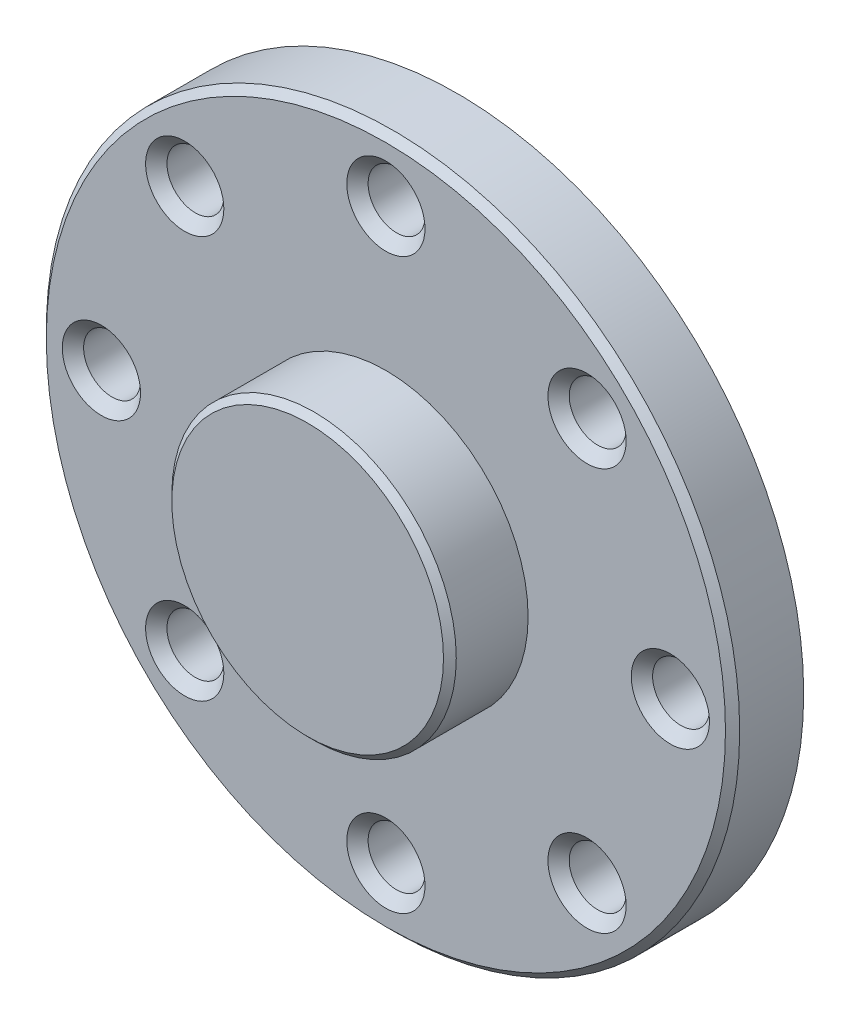
ISO-10303-21;
HEADER;
FILE_DESCRIPTION(('STEP AP214'),'2;1');
FILE_NAME('part.step','',(''),(''),'','','');
FILE_SCHEMA(('AUTOMOTIVE_DESIGN { 1 0 10303 214 1 1 1 1 }'));
ENDSEC;
DATA;
#1=APPLICATION_CONTEXT('core data for automotive mechanical design processes');
#2=APPLICATION_PROTOCOL_DEFINITION('international standard','automotive_design',2000,#1);
#3=PRODUCT_CONTEXT('',#1,'mechanical');
#4=PRODUCT('Part','Part','',(#3));
#5=PRODUCT_RELATED_PRODUCT_CATEGORY('part','',(#4));
#6=PRODUCT_DEFINITION_FORMATION('','',#4);
#7=PRODUCT_DEFINITION_CONTEXT('part definition',#1,'design');
#8=PRODUCT_DEFINITION('design','',#6,#7);
#9=PRODUCT_DEFINITION_SHAPE('','',#8);
#10=(LENGTH_UNIT() NAMED_UNIT(*) SI_UNIT(.MILLI.,.METRE.));
#11=(NAMED_UNIT(*) PLANE_ANGLE_UNIT() SI_UNIT($,.RADIAN.));
#12=(NAMED_UNIT(*) SI_UNIT($,.STERADIAN.) SOLID_ANGLE_UNIT());
#13=UNCERTAINTY_MEASURE_WITH_UNIT(LENGTH_MEASURE(1.E-05),#10,'distance_accuracy_value','');
#14=(GEOMETRIC_REPRESENTATION_CONTEXT(3) GLOBAL_UNCERTAINTY_ASSIGNED_CONTEXT((#13)) GLOBAL_UNIT_ASSIGNED_CONTEXT((#10,
#11,#12)) REPRESENTATION_CONTEXT('',''));
#15=CARTESIAN_POINT('',(0.,0.,0.));
#16=DIRECTION('',(0.,0.,1.));
#17=DIRECTION('',(1.,0.,0.));
#18=AXIS2_PLACEMENT_3D('',#15,#16,#17);
#19=CARTESIAN_POINT('',(0.,0.,2.));
#20=DIRECTION('',(0.,0.,-1.));
#21=DIRECTION('',(-1.,0.,0.));
#22=AXIS2_PLACEMENT_3D('',#19,#20,#21);
#23=CYLINDRICAL_SURFACE('',#22,9.75);
#24=CARTESIAN_POINT('',(0.,0.,1.79999999999999));
#25=DIRECTION('',(0.,0.,1.));
#26=DIRECTION('',(1.,0.,0.));
#27=AXIS2_PLACEMENT_3D('',#24,#25,#26);
#28=CIRCLE('',#27,9.75);
#29=CARTESIAN_POINT('',(9.75,0.,1.79999999999999));
#30=VERTEX_POINT('',#29);
#31=EDGE_CURVE('E96',#30,#30,#28,.F.);
#32=ORIENTED_EDGE('',*,*,#31,.T.);
#33=EDGE_LOOP('',(#32));
#34=FACE_BOUND('',#33,.T.);
#35=CARTESIAN_POINT('',(0.,0.,0.));
#36=DIRECTION('',(0.,0.,1.));
#37=DIRECTION('',(1.,0.,0.));
#38=AXIS2_PLACEMENT_3D('',#35,#36,#37);
#39=CIRCLE('',#38,9.75);
#40=CARTESIAN_POINT('',(9.75,0.,0.));
#41=VERTEX_POINT('',#40);
#42=EDGE_CURVE('E103',#41,#41,#39,.T.);
#43=ORIENTED_EDGE('',*,*,#42,.T.);
#44=EDGE_LOOP('',(#43));
#45=FACE_BOUND('',#44,.T.);
#46=ADVANCED_FACE('F33',(#34,#45),#23,.T.);
#47=CARTESIAN_POINT('',(0.,0.,2.));
#48=DIRECTION('',(0.,0.,1.));
#49=DIRECTION('',(1.,0.,0.));
#50=AXIS2_PLACEMENT_3D('',#47,#48,#49);
#51=PLANE('',#50);
#52=CARTESIAN_POINT('',(-5.65685424949231,5.65685424949245,2.));
#53=DIRECTION('',(0.,0.,1.));
#54=DIRECTION('',(1.,0.,0.));
#55=AXIS2_PLACEMENT_3D('',#52,#53,#54);
#56=CIRCLE('',#55,1.10000000000001);
#57=CARTESIAN_POINT('',(-4.5568542494923,5.65685424949245,2.));
#58=VERTEX_POINT('',#57);
#59=EDGE_CURVE('E10',#58,#58,#56,.F.);
#60=ORIENTED_EDGE('',*,*,#59,.T.);
#61=EDGE_LOOP('',(#60));
#62=FACE_BOUND('',#61,.T.);
#63=CARTESIAN_POINT('',(-8.,0.,2.));
#64=DIRECTION('',(0.,0.,1.));
#65=DIRECTION('',(1.,0.,0.));
#66=AXIS2_PLACEMENT_3D('',#63,#64,#65);
#67=CIRCLE('',#66,1.1);
#68=CARTESIAN_POINT('',(-6.9,0.,2.));
#69=VERTEX_POINT('',#68);
#70=EDGE_CURVE('E45',#69,#69,#67,.F.);
#71=ORIENTED_EDGE('',*,*,#70,.T.);
#72=EDGE_LOOP('',(#71));
#73=FACE_BOUND('',#72,.T.);
#74=CARTESIAN_POINT('',(-5.65685424949243,-5.65685424949233,2.));
#75=DIRECTION('',(0.,0.,1.));
#76=DIRECTION('',(1.,0.,0.));
#77=AXIS2_PLACEMENT_3D('',#74,#75,#76);
#78=CIRCLE('',#77,1.1);
#79=CARTESIAN_POINT('',(-4.55685424949243,-5.65685424949233,2.));
#80=VERTEX_POINT('',#79);
#81=EDGE_CURVE('E54',#80,#80,#78,.F.);
#82=ORIENTED_EDGE('',*,*,#81,.T.);
#83=EDGE_LOOP('',(#82));
#84=FACE_BOUND('',#83,.T.);
#85=CARTESIAN_POINT('',(0.,-8.,2.));
#86=DIRECTION('',(0.,0.,1.));
#87=DIRECTION('',(1.,0.,0.));
#88=AXIS2_PLACEMENT_3D('',#85,#86,#87);
#89=CIRCLE('',#88,1.1);
#90=CARTESIAN_POINT('',(1.1,-8.,2.));
#91=VERTEX_POINT('',#90);
#92=EDGE_CURVE('E60',#91,#91,#89,.F.);
#93=ORIENTED_EDGE('',*,*,#92,.T.);
#94=EDGE_LOOP('',(#93));
#95=FACE_BOUND('',#94,.T.);
#96=CARTESIAN_POINT('',(5.65685424949235,-5.65685424949241,2.));
#97=DIRECTION('',(0.,0.,1.));
#98=DIRECTION('',(1.,0.,0.));
#99=AXIS2_PLACEMENT_3D('',#96,#97,#98);
#100=CIRCLE('',#99,1.10000000000001);
#101=CARTESIAN_POINT('',(6.75685424949236,-5.65685424949241,2.));
#102=VERTEX_POINT('',#101);
#103=EDGE_CURVE('E66',#102,#102,#100,.F.);
#104=ORIENTED_EDGE('',*,*,#103,.T.);
#105=EDGE_LOOP('',(#104));
#106=FACE_BOUND('',#105,.T.);
#107=CARTESIAN_POINT('',(8.,0.,2.));
#108=DIRECTION('',(0.,0.,1.));
#109=DIRECTION('',(1.,0.,0.));
#110=AXIS2_PLACEMENT_3D('',#107,#108,#109);
#111=CIRCLE('',#110,1.1);
#112=CARTESIAN_POINT('',(9.1,0.,2.));
#113=VERTEX_POINT('',#112);
#114=EDGE_CURVE('E72',#113,#113,#111,.F.);
#115=ORIENTED_EDGE('',*,*,#114,.T.);
#116=EDGE_LOOP('',(#115));
#117=FACE_BOUND('',#116,.T.);
#118=CARTESIAN_POINT('',(5.65685424949239,5.65685424949237,2.));
#119=DIRECTION('',(0.,0.,1.));
#120=DIRECTION('',(1.,0.,0.));
#121=AXIS2_PLACEMENT_3D('',#118,#119,#120);
#122=CIRCLE('',#121,1.1);
#123=CARTESIAN_POINT('',(6.75685424949239,5.65685424949237,2.));
#124=VERTEX_POINT('',#123);
#125=EDGE_CURVE('E78',#124,#124,#122,.F.);
#126=ORIENTED_EDGE('',*,*,#125,.T.);
#127=EDGE_LOOP('',(#126));
#128=FACE_BOUND('',#127,.T.);
#129=CARTESIAN_POINT('',(0.,8.,2.));
#130=DIRECTION('',(0.,0.,1.));
#131=DIRECTION('',(1.,0.,0.));
#132=AXIS2_PLACEMENT_3D('',#129,#130,#131);
#133=CIRCLE('',#132,1.1);
#134=CARTESIAN_POINT('',(1.1,8.,2.));
#135=VERTEX_POINT('',#134);
#136=EDGE_CURVE('E84',#135,#135,#133,.F.);
#137=ORIENTED_EDGE('',*,*,#136,.T.);
#138=EDGE_LOOP('',(#137));
#139=FACE_BOUND('',#138,.T.);
#140=CARTESIAN_POINT('',(0.,0.,2.));
#141=DIRECTION('',(0.,0.,1.));
#142=DIRECTION('',(1.,0.,0.));
#143=AXIS2_PLACEMENT_3D('',#140,#141,#142);
#144=CIRCLE('',#143,9.55);
#145=CARTESIAN_POINT('',(9.55,0.,2.));
#146=VERTEX_POINT('',#145);
#147=EDGE_CURVE('E99',#146,#146,#144,.T.);
#148=ORIENTED_EDGE('',*,*,#147,.T.);
#149=EDGE_LOOP('',(#148));
#150=FACE_BOUND('',#149,.T.);
#151=CARTESIAN_POINT('',(0.,0.,2.));
#152=DIRECTION('',(0.,0.,1.));
#153=DIRECTION('',(1.,0.,0.));
#154=AXIS2_PLACEMENT_3D('',#151,#152,#153);
#155=CIRCLE('',#154,4.);
#156=CARTESIAN_POINT('',(4.,0.,2.));
#157=VERTEX_POINT('',#156);
#158=EDGE_CURVE('E102',#157,#157,#155,.T.);
#159=ORIENTED_EDGE('',*,*,#158,.F.);
#160=EDGE_LOOP('',(#159));
#161=FACE_BOUND('',#160,.T.);
#162=ADVANCED_FACE('F152',(#62,#73,#84,#95,#106,#117,#128,#139,#150,#161),#51,.T.);
#163=CARTESIAN_POINT('',(0.,0.,0.));
#164=DIRECTION('',(0.,0.,1.));
#165=DIRECTION('',(1.,0.,0.));
#166=AXIS2_PLACEMENT_3D('',#163,#164,#165);
#167=PLANE('',#166);
#168=CARTESIAN_POINT('',(8.,0.,0.));
#169=DIRECTION('',(0.,0.,1.));
#170=DIRECTION('',(0.,-1.,0.));
#171=AXIS2_PLACEMENT_3D('',#168,#169,#170);
#172=CIRCLE('',#171,0.8);
#173=CARTESIAN_POINT('',(8.,-0.800000000000028,0.));
#174=VERTEX_POINT('',#173);
#175=EDGE_CURVE('E114',#174,#174,#172,.T.);
#176=ORIENTED_EDGE('',*,*,#175,.T.);
#177=EDGE_LOOP('',(#176));
#178=FACE_BOUND('',#177,.T.);
#179=CARTESIAN_POINT('',(5.65685424949235,-5.65685424949241,0.));
#180=DIRECTION('',(0.,0.,1.));
#181=DIRECTION('',(-0.707106781186551,-0.707106781186544,0.));
#182=AXIS2_PLACEMENT_3D('',#179,#180,#181);
#183=CIRCLE('',#182,0.8);
#184=CARTESIAN_POINT('',(5.09116882454311,-6.22253967444165,0.));
#185=VERTEX_POINT('',#184);
#186=EDGE_CURVE('E122',#185,#185,#183,.T.);
#187=ORIENTED_EDGE('',*,*,#186,.T.);
#188=EDGE_LOOP('',(#187));
#189=FACE_BOUND('',#188,.T.);
#190=CARTESIAN_POINT('',(0.,-8.,0.));
#191=DIRECTION('',(0.,0.,1.));
#192=DIRECTION('',(-1.,0.,0.));
#193=AXIS2_PLACEMENT_3D('',#190,#191,#192);
#194=CIRCLE('',#193,0.8);
#195=CARTESIAN_POINT('',(-0.8,-8.,0.));
#196=VERTEX_POINT('',#195);
#197=EDGE_CURVE('E118',#196,#196,#194,.T.);
#198=ORIENTED_EDGE('',*,*,#197,.T.);
#199=EDGE_LOOP('',(#198));
#200=FACE_BOUND('',#199,.T.);
#201=CARTESIAN_POINT('',(-5.65685424949243,-5.65685424949233,0.));
#202=DIRECTION('',(0.,0.,1.));
#203=DIRECTION('',(-0.707106781186541,0.707106781186554,0.));
#204=AXIS2_PLACEMENT_3D('',#201,#202,#203);
#205=CIRCLE('',#204,0.8);
#206=CARTESIAN_POINT('',(-6.22253967444166,-5.09116882454309,0.));
#207=VERTEX_POINT('',#206);
#208=EDGE_CURVE('E115',#207,#207,#205,.T.);
#209=ORIENTED_EDGE('',*,*,#208,.T.);
#210=EDGE_LOOP('',(#209));
#211=FACE_BOUND('',#210,.T.);
#212=CARTESIAN_POINT('',(-8.,0.,0.));
#213=DIRECTION('',(0.,0.,1.));
#214=DIRECTION('',(0.,1.,0.));
#215=AXIS2_PLACEMENT_3D('',#212,#213,#214);
#216=CIRCLE('',#215,0.8);
#217=CARTESIAN_POINT('',(-7.99999999999999,0.800000000000084,0.));
#218=VERTEX_POINT('',#217);
#219=EDGE_CURVE('E119',#218,#218,#216,.T.);
#220=ORIENTED_EDGE('',*,*,#219,.T.);
#221=EDGE_LOOP('',(#220));
#222=FACE_BOUND('',#221,.T.);
#223=CARTESIAN_POINT('',(-5.65685424949231,5.65685424949245,0.));
#224=DIRECTION('',(0.,0.,1.));
#225=DIRECTION('',(0.707106781186556,0.707106781186539,0.));
#226=AXIS2_PLACEMENT_3D('',#223,#224,#225);
#227=CIRCLE('',#226,0.8);
#228=CARTESIAN_POINT('',(-5.09116882454307,6.22253967444168,0.));
#229=VERTEX_POINT('',#228);
#230=EDGE_CURVE('E127',#229,#229,#227,.T.);
#231=ORIENTED_EDGE('',*,*,#230,.T.);
#232=EDGE_LOOP('',(#231));
#233=FACE_BOUND('',#232,.T.);
#234=CARTESIAN_POINT('',(5.65685424949239,5.65685424949237,0.));
#235=DIRECTION('',(0.,0.,1.));
#236=DIRECTION('',(0.707106781186546,-0.707106781186549,0.));
#237=AXIS2_PLACEMENT_3D('',#234,#235,#236);
#238=CIRCLE('',#237,0.8);
#239=CARTESIAN_POINT('',(6.22253967444163,5.09116882454313,0.));
#240=VERTEX_POINT('',#239);
#241=EDGE_CURVE('E111',#240,#240,#238,.T.);
#242=ORIENTED_EDGE('',*,*,#241,.T.);
#243=EDGE_LOOP('',(#242));
#244=FACE_BOUND('',#243,.T.);
#245=CARTESIAN_POINT('',(0.,8.,0.));
#246=DIRECTION('',(0.,0.,1.));
#247=DIRECTION('',(1.,0.,0.));
#248=AXIS2_PLACEMENT_3D('',#245,#246,#247);
#249=CIRCLE('',#248,0.8);
#250=CARTESIAN_POINT('',(0.8,8.,0.));
#251=VERTEX_POINT('',#250);
#252=EDGE_CURVE('E106',#251,#251,#249,.T.);
#253=ORIENTED_EDGE('',*,*,#252,.T.);
#254=EDGE_LOOP('',(#253));
#255=FACE_BOUND('',#254,.T.);
#256=ORIENTED_EDGE('',*,*,#42,.F.);
#257=EDGE_LOOP('',(#256));
#258=FACE_BOUND('',#257,.T.);
#259=ADVANCED_FACE('F133',(#178,#189,#200,#211,#222,#233,#244,#255,#258),#167,.F.);
#260=CARTESIAN_POINT('',(0.,0.,4.2));
#261=DIRECTION('',(0.,0.,-1.));
#262=DIRECTION('',(-1.,0.,0.));
#263=AXIS2_PLACEMENT_3D('',#260,#261,#262);
#264=CYLINDRICAL_SURFACE('',#263,4.);
#265=CARTESIAN_POINT('',(0.,0.,4.02));
#266=DIRECTION('',(0.,0.,1.));
#267=DIRECTION('',(1.,0.,0.));
#268=AXIS2_PLACEMENT_3D('',#265,#266,#267);
#269=CIRCLE('',#268,4.);
#270=CARTESIAN_POINT('',(4.,0.,4.02));
#271=VERTEX_POINT('',#270);
#272=EDGE_CURVE('E90',#271,#271,#269,.F.);
#273=ORIENTED_EDGE('',*,*,#272,.T.);
#274=EDGE_LOOP('',(#273));
#275=FACE_BOUND('',#274,.T.);
#276=ORIENTED_EDGE('',*,*,#158,.T.);
#277=EDGE_LOOP('',(#276));
#278=FACE_BOUND('',#277,.T.);
#279=ADVANCED_FACE('F251',(#275,#278),#264,.T.);
#280=CARTESIAN_POINT('',(0.,0.,4.2));
#281=DIRECTION('',(0.,0.,1.));
#282=DIRECTION('',(1.,0.,0.));
#283=AXIS2_PLACEMENT_3D('',#280,#281,#282);
#284=PLANE('',#283);
#285=CARTESIAN_POINT('',(0.,0.,4.2));
#286=DIRECTION('',(0.,0.,1.));
#287=DIRECTION('',(1.,0.,0.));
#288=AXIS2_PLACEMENT_3D('',#285,#286,#287);
#289=CIRCLE('',#288,3.82);
#290=CARTESIAN_POINT('',(3.82,0.,4.2));
#291=VERTEX_POINT('',#290);
#292=EDGE_CURVE('E93',#291,#291,#289,.T.);
#293=ORIENTED_EDGE('',*,*,#292,.T.);
#294=EDGE_LOOP('',(#293));
#295=FACE_BOUND('',#294,.T.);
#296=ADVANCED_FACE('F170',(#295),#284,.T.);
#297=CARTESIAN_POINT('',(0.,0.,2.));
#298=DIRECTION('',(0.,0.,-1.));
#299=DIRECTION('',(-1.,0.,0.));
#300=AXIS2_PLACEMENT_3D('',#297,#298,#299);
#301=CONICAL_SURFACE('',#300,9.55,0.785398163397444);
#302=ORIENTED_EDGE('',*,*,#31,.F.);
#303=EDGE_LOOP('',(#302));
#304=FACE_BOUND('',#303,.T.);
#305=ORIENTED_EDGE('',*,*,#147,.F.);
#306=EDGE_LOOP('',(#305));
#307=FACE_BOUND('',#306,.T.);
#308=ADVANCED_FACE('F163',(#304,#307),#301,.T.);
#309=CARTESIAN_POINT('',(0.,0.,4.2));
#310=DIRECTION('',(0.,0.,-1.));
#311=DIRECTION('',(-1.,0.,0.));
#312=AXIS2_PLACEMENT_3D('',#309,#310,#311);
#313=CONICAL_SURFACE('',#312,3.82,0.785398163397446);
#314=ORIENTED_EDGE('',*,*,#272,.F.);
#315=EDGE_LOOP('',(#314));
#316=FACE_BOUND('',#315,.T.);
#317=ORIENTED_EDGE('',*,*,#292,.F.);
#318=EDGE_LOOP('',(#317));
#319=FACE_BOUND('',#318,.T.);
#320=ADVANCED_FACE('F169',(#316,#319),#313,.T.);
#321=CARTESIAN_POINT('',(0.,8.,0.));
#322=DIRECTION('',(0.,0.,1.));
#323=DIRECTION('',(1.,0.,0.));
#324=AXIS2_PLACEMENT_3D('',#321,#322,#323);
#325=CYLINDRICAL_SURFACE('',#324,0.8);
#326=CARTESIAN_POINT('',(0.,8.,1.7));
#327=DIRECTION('',(0.,0.,1.));
#328=DIRECTION('',(1.,0.,0.));
#329=AXIS2_PLACEMENT_3D('',#326,#327,#328);
#330=CIRCLE('',#329,0.8);
#331=CARTESIAN_POINT('',(0.8,8.,1.7));
#332=VERTEX_POINT('',#331);
#333=EDGE_CURVE('E87',#332,#332,#330,.T.);
#334=ORIENTED_EDGE('',*,*,#333,.T.);
#335=EDGE_LOOP('',(#334));
#336=FACE_BOUND('',#335,.T.);
#337=ORIENTED_EDGE('',*,*,#252,.F.);
#338=EDGE_LOOP('',(#337));
#339=FACE_BOUND('',#338,.T.);
#340=ADVANCED_FACE('F177',(#336,#339),#325,.F.);
#341=CARTESIAN_POINT('',(0.,8.,1.7));
#342=DIRECTION('',(0.,0.,1.));
#343=DIRECTION('',(1.,0.,0.));
#344=AXIS2_PLACEMENT_3D('',#341,#342,#343);
#345=CONICAL_SURFACE('',#344,0.8,0.785398163397446);
#346=ORIENTED_EDGE('',*,*,#136,.F.);
#347=EDGE_LOOP('',(#346));
#348=FACE_BOUND('',#347,.T.);
#349=ORIENTED_EDGE('',*,*,#333,.F.);
#350=EDGE_LOOP('',(#349));
#351=FACE_BOUND('',#350,.T.);
#352=ADVANCED_FACE('F179',(#348,#351),#345,.F.);
#353=CARTESIAN_POINT('',(5.65685424949239,5.65685424949237,0.));
#354=DIRECTION('',(0.,0.,1.));
#355=DIRECTION('',(1.,0.,0.));
#356=AXIS2_PLACEMENT_3D('',#353,#354,#355);
#357=CYLINDRICAL_SURFACE('',#356,0.8);
#358=CARTESIAN_POINT('',(5.65685424949239,5.65685424949237,1.7));
#359=DIRECTION('',(0.,0.,1.));
#360=DIRECTION('',(1.,0.,0.));
#361=AXIS2_PLACEMENT_3D('',#358,#359,#360);
#362=CIRCLE('',#361,0.8);
#363=CARTESIAN_POINT('',(6.45685424949239,5.65685424949237,1.7));
#364=VERTEX_POINT('',#363);
#365=EDGE_CURVE('E81',#364,#364,#362,.T.);
#366=ORIENTED_EDGE('',*,*,#365,.T.);
#367=EDGE_LOOP('',(#366));
#368=FACE_BOUND('',#367,.T.);
#369=ORIENTED_EDGE('',*,*,#241,.F.);
#370=EDGE_LOOP('',(#369));
#371=FACE_BOUND('',#370,.T.);
#372=ADVANCED_FACE('F149',(#368,#371),#357,.F.);
#373=CARTESIAN_POINT('',(-5.65685424949231,5.65685424949245,0.));
#374=DIRECTION('',(0.,0.,1.));
#375=DIRECTION('',(1.,0.,0.));
#376=AXIS2_PLACEMENT_3D('',#373,#374,#375);
#377=CYLINDRICAL_SURFACE('',#376,0.8);
#378=CARTESIAN_POINT('',(-5.65685424949231,5.65685424949245,1.69999999999999));
#379=DIRECTION('',(0.,0.,1.));
#380=DIRECTION('',(1.,0.,0.));
#381=AXIS2_PLACEMENT_3D('',#378,#379,#380);
#382=CIRCLE('',#381,0.8);
#383=CARTESIAN_POINT('',(-4.85685424949231,5.65685424949245,1.69999999999999));
#384=VERTEX_POINT('',#383);
#385=EDGE_CURVE('E41',#384,#384,#382,.T.);
#386=ORIENTED_EDGE('',*,*,#385,.T.);
#387=EDGE_LOOP('',(#386));
#388=FACE_BOUND('',#387,.T.);
#389=ORIENTED_EDGE('',*,*,#230,.F.);
#390=EDGE_LOOP('',(#389));
#391=FACE_BOUND('',#390,.T.);
#392=ADVANCED_FACE('F139',(#388,#391),#377,.F.);
#393=CARTESIAN_POINT('',(-8.,0.,0.));
#394=DIRECTION('',(0.,0.,1.));
#395=DIRECTION('',(1.,0.,0.));
#396=AXIS2_PLACEMENT_3D('',#393,#394,#395);
#397=CYLINDRICAL_SURFACE('',#396,0.8);
#398=CARTESIAN_POINT('',(-8.,0.,1.7));
#399=DIRECTION('',(0.,0.,1.));
#400=DIRECTION('',(1.,0.,0.));
#401=AXIS2_PLACEMENT_3D('',#398,#399,#400);
#402=CIRCLE('',#401,0.8);
#403=CARTESIAN_POINT('',(-7.2,0.,1.7));
#404=VERTEX_POINT('',#403);
#405=EDGE_CURVE('E49',#404,#404,#402,.T.);
#406=ORIENTED_EDGE('',*,*,#405,.T.);
#407=EDGE_LOOP('',(#406));
#408=FACE_BOUND('',#407,.T.);
#409=ORIENTED_EDGE('',*,*,#219,.F.);
#410=EDGE_LOOP('',(#409));
#411=FACE_BOUND('',#410,.T.);
#412=ADVANCED_FACE('F136',(#408,#411),#397,.F.);
#413=CARTESIAN_POINT('',(-5.65685424949243,-5.65685424949233,0.));
#414=DIRECTION('',(0.,0.,1.));
#415=DIRECTION('',(1.,0.,0.));
#416=AXIS2_PLACEMENT_3D('',#413,#414,#415);
#417=CYLINDRICAL_SURFACE('',#416,0.8);
#418=CARTESIAN_POINT('',(-5.65685424949243,-5.65685424949233,1.7));
#419=DIRECTION('',(0.,0.,1.));
#420=DIRECTION('',(1.,0.,0.));
#421=AXIS2_PLACEMENT_3D('',#418,#419,#420);
#422=CIRCLE('',#421,0.8);
#423=CARTESIAN_POINT('',(-4.85685424949243,-5.65685424949233,1.7));
#424=VERTEX_POINT('',#423);
#425=EDGE_CURVE('E57',#424,#424,#422,.T.);
#426=ORIENTED_EDGE('',*,*,#425,.T.);
#427=EDGE_LOOP('',(#426));
#428=FACE_BOUND('',#427,.T.);
#429=ORIENTED_EDGE('',*,*,#208,.F.);
#430=EDGE_LOOP('',(#429));
#431=FACE_BOUND('',#430,.T.);
#432=ADVANCED_FACE('F138',(#428,#431),#417,.F.);
#433=CARTESIAN_POINT('',(0.,-8.,0.));
#434=DIRECTION('',(0.,0.,1.));
#435=DIRECTION('',(1.,0.,0.));
#436=AXIS2_PLACEMENT_3D('',#433,#434,#435);
#437=CYLINDRICAL_SURFACE('',#436,0.8);
#438=CARTESIAN_POINT('',(0.,-8.,1.7));
#439=DIRECTION('',(0.,0.,1.));
#440=DIRECTION('',(1.,0.,0.));
#441=AXIS2_PLACEMENT_3D('',#438,#439,#440);
#442=CIRCLE('',#441,0.8);
#443=CARTESIAN_POINT('',(0.8,-8.,1.7));
#444=VERTEX_POINT('',#443);
#445=EDGE_CURVE('E63',#444,#444,#442,.T.);
#446=ORIENTED_EDGE('',*,*,#445,.T.);
#447=EDGE_LOOP('',(#446));
#448=FACE_BOUND('',#447,.T.);
#449=ORIENTED_EDGE('',*,*,#197,.F.);
#450=EDGE_LOOP('',(#449));
#451=FACE_BOUND('',#450,.T.);
#452=ADVANCED_FACE('F146',(#448,#451),#437,.F.);
#453=CARTESIAN_POINT('',(5.65685424949235,-5.65685424949241,0.));
#454=DIRECTION('',(0.,0.,1.));
#455=DIRECTION('',(1.,0.,0.));
#456=AXIS2_PLACEMENT_3D('',#453,#454,#455);
#457=CYLINDRICAL_SURFACE('',#456,0.8);
#458=CARTESIAN_POINT('',(5.65685424949235,-5.65685424949241,1.69999999999999));
#459=DIRECTION('',(0.,0.,1.));
#460=DIRECTION('',(1.,0.,0.));
#461=AXIS2_PLACEMENT_3D('',#458,#459,#460);
#462=CIRCLE('',#461,0.8);
#463=CARTESIAN_POINT('',(6.45685424949235,-5.65685424949241,1.69999999999999));
#464=VERTEX_POINT('',#463);
#465=EDGE_CURVE('E69',#464,#464,#462,.T.);
#466=ORIENTED_EDGE('',*,*,#465,.T.);
#467=EDGE_LOOP('',(#466));
#468=FACE_BOUND('',#467,.T.);
#469=ORIENTED_EDGE('',*,*,#186,.F.);
#470=EDGE_LOOP('',(#469));
#471=FACE_BOUND('',#470,.T.);
#472=ADVANCED_FACE('F271',(#468,#471),#457,.F.);
#473=CARTESIAN_POINT('',(8.,0.,0.));
#474=DIRECTION('',(0.,0.,1.));
#475=DIRECTION('',(1.,0.,0.));
#476=AXIS2_PLACEMENT_3D('',#473,#474,#475);
#477=CYLINDRICAL_SURFACE('',#476,0.8);
#478=CARTESIAN_POINT('',(8.,0.,1.7));
#479=DIRECTION('',(0.,0.,1.));
#480=DIRECTION('',(1.,0.,0.));
#481=AXIS2_PLACEMENT_3D('',#478,#479,#480);
#482=CIRCLE('',#481,0.8);
#483=CARTESIAN_POINT('',(8.8,0.,1.7));
#484=VERTEX_POINT('',#483);
#485=EDGE_CURVE('E75',#484,#484,#482,.T.);
#486=ORIENTED_EDGE('',*,*,#485,.T.);
#487=EDGE_LOOP('',(#486));
#488=FACE_BOUND('',#487,.T.);
#489=ORIENTED_EDGE('',*,*,#175,.F.);
#490=EDGE_LOOP('',(#489));
#491=FACE_BOUND('',#490,.T.);
#492=ADVANCED_FACE('F193',(#488,#491),#477,.F.);
#493=CARTESIAN_POINT('',(5.65685424949239,5.65685424949237,1.7));
#494=DIRECTION('',(0.,0.,1.));
#495=DIRECTION('',(1.,0.,0.));
#496=AXIS2_PLACEMENT_3D('',#493,#494,#495);
#497=CONICAL_SURFACE('',#496,0.8,0.785398163397447);
#498=ORIENTED_EDGE('',*,*,#125,.F.);
#499=EDGE_LOOP('',(#498));
#500=FACE_BOUND('',#499,.T.);
#501=ORIENTED_EDGE('',*,*,#365,.F.);
#502=EDGE_LOOP('',(#501));
#503=FACE_BOUND('',#502,.T.);
#504=ADVANCED_FACE('F186',(#500,#503),#497,.F.);
#505=CARTESIAN_POINT('',(8.,0.,1.7));
#506=DIRECTION('',(0.,0.,1.));
#507=DIRECTION('',(1.,0.,0.));
#508=AXIS2_PLACEMENT_3D('',#505,#506,#507);
#509=CONICAL_SURFACE('',#508,0.8,0.785398163397446);
#510=ORIENTED_EDGE('',*,*,#114,.F.);
#511=EDGE_LOOP('',(#510));
#512=FACE_BOUND('',#511,.T.);
#513=ORIENTED_EDGE('',*,*,#485,.F.);
#514=EDGE_LOOP('',(#513));
#515=FACE_BOUND('',#514,.T.);
#516=ADVANCED_FACE('F192',(#512,#515),#509,.F.);
#517=CARTESIAN_POINT('',(5.65685424949235,-5.65685424949241,1.69999999999999));
#518=DIRECTION('',(0.,0.,1.));
#519=DIRECTION('',(1.,0.,0.));
#520=AXIS2_PLACEMENT_3D('',#517,#518,#519);
#521=CONICAL_SURFACE('',#520,0.8,0.785398163397452);
#522=ORIENTED_EDGE('',*,*,#103,.F.);
#523=EDGE_LOOP('',(#522));
#524=FACE_BOUND('',#523,.T.);
#525=ORIENTED_EDGE('',*,*,#465,.F.);
#526=EDGE_LOOP('',(#525));
#527=FACE_BOUND('',#526,.T.);
#528=ADVANCED_FACE('F200',(#524,#527),#521,.F.);
#529=CARTESIAN_POINT('',(0.,-8.,1.7));
#530=DIRECTION('',(0.,0.,1.));
#531=DIRECTION('',(1.,0.,0.));
#532=AXIS2_PLACEMENT_3D('',#529,#530,#531);
#533=CONICAL_SURFACE('',#532,0.8,0.785398163397446);
#534=ORIENTED_EDGE('',*,*,#92,.F.);
#535=EDGE_LOOP('',(#534));
#536=FACE_BOUND('',#535,.T.);
#537=ORIENTED_EDGE('',*,*,#445,.F.);
#538=EDGE_LOOP('',(#537));
#539=FACE_BOUND('',#538,.T.);
#540=ADVANCED_FACE('F207',(#536,#539),#533,.F.);
#541=CARTESIAN_POINT('',(-5.65685424949243,-5.65685424949233,1.7));
#542=DIRECTION('',(0.,0.,1.));
#543=DIRECTION('',(1.,0.,0.));
#544=AXIS2_PLACEMENT_3D('',#541,#542,#543);
#545=CONICAL_SURFACE('',#544,0.8,0.78539816339745);
#546=CARTESIAN_POINT('',(-4.55685424949243,-5.65685424949233,2.));
#547=CARTESIAN_POINT('',(-4.55997924949243,-5.65685424949233,1.996875));
#548=CARTESIAN_POINT('',(-4.56310424949243,-5.65685424949233,1.99375));
#549=CARTESIAN_POINT('',(-4.56935424949243,-5.65685424949233,1.9875));
#550=CARTESIAN_POINT('',(-4.57247924949243,-5.65685424949233,1.984375));
#551=CARTESIAN_POINT('',(-4.57872924949243,-5.65685424949233,1.978125));
#552=CARTESIAN_POINT('',(-4.58185424949243,-5.65685424949233,1.975));
#553=CARTESIAN_POINT('',(-4.58810424949243,-5.65685424949233,1.96875));
#554=CARTESIAN_POINT('',(-4.59122924949243,-5.65685424949233,1.965625));
#555=CARTESIAN_POINT('',(-4.59747924949243,-5.65685424949233,1.959375));
#556=CARTESIAN_POINT('',(-4.60060424949243,-5.65685424949233,1.95625));
#557=CARTESIAN_POINT('',(-4.60685424949243,-5.65685424949233,1.95));
#558=CARTESIAN_POINT('',(-4.60997924949243,-5.65685424949233,1.946875));
#559=CARTESIAN_POINT('',(-4.61622924949243,-5.65685424949233,1.940625));
#560=CARTESIAN_POINT('',(-4.61935424949243,-5.65685424949233,1.9375));
#561=CARTESIAN_POINT('',(-4.62560424949243,-5.65685424949233,1.93125));
#562=CARTESIAN_POINT('',(-4.62872924949243,-5.65685424949233,1.928125));
#563=CARTESIAN_POINT('',(-4.63497924949243,-5.65685424949233,1.921875));
#564=CARTESIAN_POINT('',(-4.63810424949243,-5.65685424949233,1.91875));
#565=CARTESIAN_POINT('',(-4.64435424949243,-5.65685424949233,1.9125));
#566=CARTESIAN_POINT('',(-4.64747924949243,-5.65685424949233,1.909375));
#567=CARTESIAN_POINT('',(-4.65372924949243,-5.65685424949233,1.903125));
#568=CARTESIAN_POINT('',(-4.65685424949243,-5.65685424949233,1.9));
#569=CARTESIAN_POINT('',(-4.66310424949243,-5.65685424949233,1.89375));
#570=CARTESIAN_POINT('',(-4.66622924949243,-5.65685424949233,1.890625));
#571=CARTESIAN_POINT('',(-4.67247924949243,-5.65685424949233,1.884375));
#572=CARTESIAN_POINT('',(-4.67560424949243,-5.65685424949233,1.88125));
#573=CARTESIAN_POINT('',(-4.68185424949243,-5.65685424949233,1.875));
#574=CARTESIAN_POINT('',(-4.68497924949243,-5.65685424949233,1.871875));
#575=CARTESIAN_POINT('',(-4.69122924949243,-5.65685424949233,1.865625));
#576=CARTESIAN_POINT('',(-4.69435424949243,-5.65685424949233,1.8625));
#577=CARTESIAN_POINT('',(-4.70060424949243,-5.65685424949233,1.85625));
#578=CARTESIAN_POINT('',(-4.70372924949243,-5.65685424949233,1.853125));
#579=CARTESIAN_POINT('',(-4.70997924949243,-5.65685424949233,1.846875));
#580=CARTESIAN_POINT('',(-4.71310424949243,-5.65685424949233,1.84375));
#581=CARTESIAN_POINT('',(-4.71935424949243,-5.65685424949233,1.8375));
#582=CARTESIAN_POINT('',(-4.72247924949243,-5.65685424949233,1.834375));
#583=CARTESIAN_POINT('',(-4.72872924949243,-5.65685424949233,1.828125));
#584=CARTESIAN_POINT('',(-4.73185424949243,-5.65685424949233,1.825));
#585=CARTESIAN_POINT('',(-4.73810424949243,-5.65685424949233,1.81875));
#586=CARTESIAN_POINT('',(-4.74122924949243,-5.65685424949233,1.815625));
#587=CARTESIAN_POINT('',(-4.74747924949243,-5.65685424949233,1.809375));
#588=CARTESIAN_POINT('',(-4.75060424949243,-5.65685424949233,1.80625));
#589=CARTESIAN_POINT('',(-4.75685424949243,-5.65685424949233,1.8));
#590=CARTESIAN_POINT('',(-4.75997924949243,-5.65685424949233,1.796875));
#591=CARTESIAN_POINT('',(-4.76622924949243,-5.65685424949233,1.790625));
#592=CARTESIAN_POINT('',(-4.76935424949243,-5.65685424949233,1.7875));
#593=CARTESIAN_POINT('',(-4.77560424949243,-5.65685424949233,1.78125));
#594=CARTESIAN_POINT('',(-4.77872924949243,-5.65685424949233,1.778125));
#595=CARTESIAN_POINT('',(-4.78497924949243,-5.65685424949233,1.771875));
#596=CARTESIAN_POINT('',(-4.78810424949243,-5.65685424949233,1.76875));
#597=CARTESIAN_POINT('',(-4.79435424949243,-5.65685424949233,1.7625));
#598=CARTESIAN_POINT('',(-4.79747924949243,-5.65685424949233,1.759375));
#599=CARTESIAN_POINT('',(-4.80372924949243,-5.65685424949233,1.753125));
#600=CARTESIAN_POINT('',(-4.80685424949243,-5.65685424949233,1.75));
#601=CARTESIAN_POINT('',(-4.81310424949243,-5.65685424949233,1.74375));
#602=CARTESIAN_POINT('',(-4.81622924949243,-5.65685424949233,1.740625));
#603=CARTESIAN_POINT('',(-4.82247924949243,-5.65685424949233,1.734375));
#604=CARTESIAN_POINT('',(-4.82560424949243,-5.65685424949233,1.73125));
#605=CARTESIAN_POINT('',(-4.83185424949243,-5.65685424949233,1.725));
#606=CARTESIAN_POINT('',(-4.83497924949243,-5.65685424949233,1.721875));
#607=CARTESIAN_POINT('',(-4.84122924949243,-5.65685424949233,1.715625));
#608=CARTESIAN_POINT('',(-4.84435424949243,-5.65685424949233,1.7125));
#609=CARTESIAN_POINT('',(-4.85060424949243,-5.65685424949233,1.70625));
#610=CARTESIAN_POINT('',(-4.85372924949243,-5.65685424949233,1.703125));
#611=CARTESIAN_POINT('',(-4.85685424949243,-5.65685424949233,1.7));
#612=B_SPLINE_CURVE_WITH_KNOTS('',3,(#546,#547,#548,#549,#550,#551,#552,#553,#554,#555,#556,
#557,#558,#559,#560,#561,#562,#563,#564,#565,#566,#567,#568,#569,#570,#571,#572,#573,#574,#575,
#576,#577,#578,#579,#580,#581,#582,#583,#584,#585,#586,#587,#588,#589,#590,#591,#592,#593,#594,
#595,#596,#597,#598,#599,#600,#601,#602,#603,#604,#605,#606,#607,#608,#609,#610,#611),
.UNSPECIFIED.,.F.,.F.,(4,2,2,2,2,2,2,2,2,2,2,2,2,2,2,2,2,2,2,2,2,2,2,2,2,2,2,2,2,2,2,2,4),(0.,
0.0132582521472475,0.0265165042944951,0.0397747564417429,0.0530330085889911,0.0662912607362386,
0.0795495128834861,0.0928077650307338,0.106066017177982,0.11932426932523,0.132582521472477,
0.145840773619725,0.159099025766973,0.17235727791422,0.185615530061468,0.198873782208715,
0.212132034355964,0.225390286503211,0.238648538650459,0.251906790797706,0.265165042944954,
0.278423295092202,0.29168154723945,0.304939799386698,0.318198051533945,0.331456303681193,
0.34471455582844,0.357972807975688,0.371231060122936,0.384489312270184,0.397747564417431,
0.411005816564679,0.424264068711927),.UNSPECIFIED.);
#613=EDGE_CURVE('BSEAM214',#80,#424,#612,.T.);
#614=ORIENTED_EDGE('',*,*,#81,.F.);
#615=ORIENTED_EDGE('',*,*,#425,.F.);
#616=ORIENTED_EDGE('',*,*,#613,.T.);
#617=ORIENTED_EDGE('',*,*,#613,.F.);
#618=EDGE_LOOP('',(#614,#616,#615,#617));
#619=FACE_BOUND('',#618,.T.);
#620=ADVANCED_FACE('F214',(#619),#545,.F.);
#621=CARTESIAN_POINT('',(-8.,0.,1.7));
#622=DIRECTION('',(0.,0.,1.));
#623=DIRECTION('',(1.,0.,0.));
#624=AXIS2_PLACEMENT_3D('',#621,#622,#623);
#625=CONICAL_SURFACE('',#624,0.8,0.785398163397446);
#626=ORIENTED_EDGE('',*,*,#70,.F.);
#627=EDGE_LOOP('',(#626));
#628=FACE_BOUND('',#627,.T.);
#629=ORIENTED_EDGE('',*,*,#405,.F.);
#630=EDGE_LOOP('',(#629));
#631=FACE_BOUND('',#630,.T.);
#632=ADVANCED_FACE('F220',(#628,#631),#625,.F.);
#633=CARTESIAN_POINT('',(-5.65685424949231,5.65685424949245,1.69999999999999));
#634=DIRECTION('',(0.,0.,1.));
#635=DIRECTION('',(1.,0.,0.));
#636=AXIS2_PLACEMENT_3D('',#633,#634,#635);
#637=CONICAL_SURFACE('',#636,0.8,0.785398163397454);
#638=ORIENTED_EDGE('',*,*,#59,.F.);
#639=EDGE_LOOP('',(#638));
#640=FACE_BOUND('',#639,.T.);
#641=ORIENTED_EDGE('',*,*,#385,.F.);
#642=EDGE_LOOP('',(#641));
#643=FACE_BOUND('',#642,.T.);
#644=ADVANCED_FACE('F36',(#640,#643),#637,.F.);
#645=CLOSED_SHELL('',(#46,#162,#259,#279,#296,#308,#320,#340,#352,#372,#392,#412,#432,#452,#472,
#492,#504,#516,#528,#540,#620,#632,#644));
#646=MANIFOLD_SOLID_BREP('B2',#645);
#647=ADVANCED_BREP_SHAPE_REPRESENTATION('',(#18,#646),#14);
#648=SHAPE_DEFINITION_REPRESENTATION(#9,#647);
ENDSEC;
END-ISO-10303-21;
